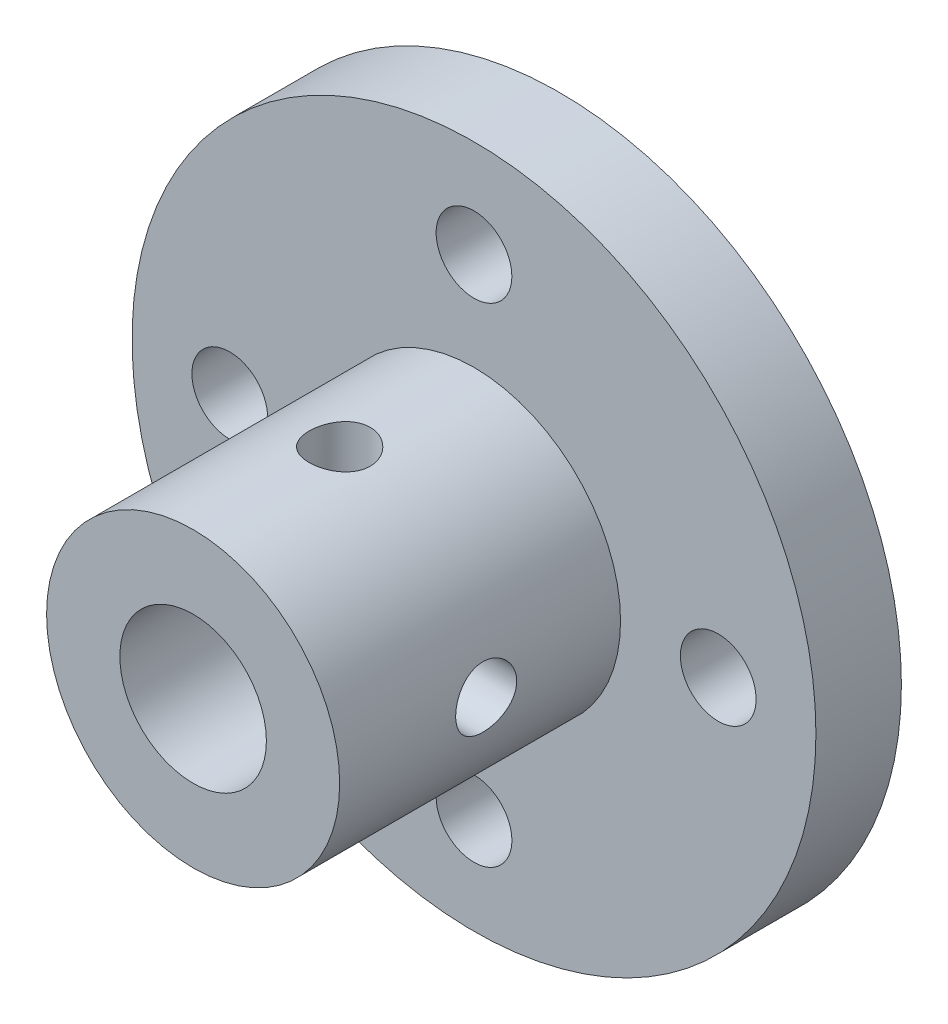
ISO-10303-21;
HEADER;
FILE_DESCRIPTION(('STEP AP214'),'2;1');
FILE_NAME('part.step','',(''),(''),'','','');
FILE_SCHEMA(('AUTOMOTIVE_DESIGN { 1 0 10303 214 1 1 1 1 }'));
ENDSEC;
DATA;
#1=APPLICATION_CONTEXT('core data for automotive mechanical design processes');
#2=APPLICATION_PROTOCOL_DEFINITION('international standard','automotive_design',2000,#1);
#3=PRODUCT_CONTEXT('',#1,'mechanical');
#4=PRODUCT('Part','Part','',(#3));
#5=PRODUCT_RELATED_PRODUCT_CATEGORY('part','',(#4));
#6=PRODUCT_DEFINITION_FORMATION('','',#4);
#7=PRODUCT_DEFINITION_CONTEXT('part definition',#1,'design');
#8=PRODUCT_DEFINITION('design','',#6,#7);
#9=PRODUCT_DEFINITION_SHAPE('','',#8);
#10=(LENGTH_UNIT() NAMED_UNIT(*) SI_UNIT(.MILLI.,.METRE.));
#11=(NAMED_UNIT(*) PLANE_ANGLE_UNIT() SI_UNIT($,.RADIAN.));
#12=(NAMED_UNIT(*) SI_UNIT($,.STERADIAN.) SOLID_ANGLE_UNIT());
#13=UNCERTAINTY_MEASURE_WITH_UNIT(LENGTH_MEASURE(1.E-05),#10,'distance_accuracy_value','');
#14=(GEOMETRIC_REPRESENTATION_CONTEXT(3) GLOBAL_UNCERTAINTY_ASSIGNED_CONTEXT((#13)) GLOBAL_UNIT_ASSIGNED_CONTEXT((#10,
#11,#12)) REPRESENTATION_CONTEXT('',''));
#15=CARTESIAN_POINT('',(0.,0.,0.));
#16=DIRECTION('',(0.,0.,1.));
#17=DIRECTION('',(1.,0.,0.));
#18=AXIS2_PLACEMENT_3D('',#15,#16,#17);
#19=CARTESIAN_POINT('',(0.,0.,3.5));
#20=DIRECTION('',(0.,0.,-1.));
#21=DIRECTION('',(-1.,0.,0.));
#22=AXIS2_PLACEMENT_3D('',#19,#20,#21);
#23=CYLINDRICAL_SURFACE('',#22,14.);
#24=CARTESIAN_POINT('',(0.,0.,3.5));
#25=DIRECTION('',(0.,0.,1.));
#26=DIRECTION('',(1.,0.,0.));
#27=AXIS2_PLACEMENT_3D('',#24,#25,#26);
#28=CIRCLE('',#27,14.);
#29=CARTESIAN_POINT('',(14.,0.,3.5));
#30=VERTEX_POINT('',#29);
#31=EDGE_CURVE('E63',#30,#30,#28,.T.);
#32=ORIENTED_EDGE('',*,*,#31,.F.);
#33=EDGE_LOOP('',(#32));
#34=FACE_BOUND('',#33,.T.);
#35=CARTESIAN_POINT('',(0.,0.,0.));
#36=DIRECTION('',(0.,0.,1.));
#37=DIRECTION('',(1.,0.,0.));
#38=AXIS2_PLACEMENT_3D('',#35,#36,#37);
#39=CIRCLE('',#38,14.);
#40=CARTESIAN_POINT('',(14.,0.,0.));
#41=VERTEX_POINT('',#40);
#42=EDGE_CURVE('E71',#41,#41,#39,.T.);
#43=ORIENTED_EDGE('',*,*,#42,.T.);
#44=EDGE_LOOP('',(#43));
#45=FACE_BOUND('',#44,.T.);
#46=ADVANCED_FACE('F50',(#34,#45),#23,.T.);
#47=CARTESIAN_POINT('',(0.,0.,3.5));
#48=DIRECTION('',(0.,0.,1.));
#49=DIRECTION('',(1.,0.,0.));
#50=AXIS2_PLACEMENT_3D('',#47,#48,#49);
#51=PLANE('',#50);
#52=CARTESIAN_POINT('',(-10.,0.,3.5));
#53=DIRECTION('',(0.,0.,1.));
#54=DIRECTION('',(0.,1.,0.));
#55=AXIS2_PLACEMENT_3D('',#52,#53,#54);
#56=CIRCLE('',#55,1.55);
#57=CARTESIAN_POINT('',(-10.,1.54999999999997,3.5));
#58=VERTEX_POINT('',#57);
#59=EDGE_CURVE('E192',#58,#58,#56,.T.);
#60=ORIENTED_EDGE('',*,*,#59,.F.);
#61=EDGE_LOOP('',(#60));
#62=FACE_BOUND('',#61,.T.);
#63=CARTESIAN_POINT('',(0.,-10.,3.5));
#64=DIRECTION('',(0.,0.,1.));
#65=DIRECTION('',(-1.,0.,0.));
#66=AXIS2_PLACEMENT_3D('',#63,#64,#65);
#67=CIRCLE('',#66,1.55);
#68=CARTESIAN_POINT('',(-1.55,-10.,3.5));
#69=VERTEX_POINT('',#68);
#70=EDGE_CURVE('E187',#69,#69,#67,.T.);
#71=ORIENTED_EDGE('',*,*,#70,.F.);
#72=EDGE_LOOP('',(#71));
#73=FACE_BOUND('',#72,.T.);
#74=CARTESIAN_POINT('',(10.,1.04744440165294E-13,3.5));
#75=DIRECTION('',(0.,0.,1.));
#76=DIRECTION('',(0.,-1.,0.));
#77=AXIS2_PLACEMENT_3D('',#74,#75,#76);
#78=CIRCLE('',#77,1.55);
#79=CARTESIAN_POINT('',(10.,-1.5499999999999,3.5));
#80=VERTEX_POINT('',#79);
#81=EDGE_CURVE('E111',#80,#80,#78,.T.);
#82=ORIENTED_EDGE('',*,*,#81,.F.);
#83=EDGE_LOOP('',(#82));
#84=FACE_BOUND('',#83,.T.);
#85=CARTESIAN_POINT('',(0.,10.,3.5));
#86=DIRECTION('',(0.,0.,1.));
#87=DIRECTION('',(1.,0.,0.));
#88=AXIS2_PLACEMENT_3D('',#85,#86,#87);
#89=CIRCLE('',#88,1.55);
#90=CARTESIAN_POINT('',(1.55,10.,3.5));
#91=VERTEX_POINT('',#90);
#92=EDGE_CURVE('E178',#91,#91,#89,.T.);
#93=ORIENTED_EDGE('',*,*,#92,.F.);
#94=EDGE_LOOP('',(#93));
#95=FACE_BOUND('',#94,.T.);
#96=CARTESIAN_POINT('',(0.,0.,3.5));
#97=DIRECTION('',(0.,0.,1.));
#98=DIRECTION('',(1.,0.,0.));
#99=AXIS2_PLACEMENT_3D('',#96,#97,#98);
#100=CIRCLE('',#99,6.);
#101=CARTESIAN_POINT('',(6.,0.,3.5));
#102=VERTEX_POINT('',#101);
#103=EDGE_CURVE('E10',#102,#102,#100,.T.);
#104=ORIENTED_EDGE('',*,*,#103,.F.);
#105=EDGE_LOOP('',(#104));
#106=FACE_BOUND('',#105,.T.);
#107=ORIENTED_EDGE('',*,*,#31,.T.);
#108=EDGE_LOOP('',(#107));
#109=FACE_BOUND('',#108,.T.);
#110=ADVANCED_FACE('F136',(#62,#73,#84,#95,#106,#109),#51,.T.);
#111=CARTESIAN_POINT('',(0.,0.,0.));
#112=DIRECTION('',(0.,0.,1.));
#113=DIRECTION('',(1.,0.,0.));
#114=AXIS2_PLACEMENT_3D('',#111,#112,#113);
#115=PLANE('',#114);
#116=CARTESIAN_POINT('',(-10.,0.,0.));
#117=DIRECTION('',(0.,0.,1.));
#118=DIRECTION('',(0.,1.,0.));
#119=AXIS2_PLACEMENT_3D('',#116,#117,#118);
#120=CIRCLE('',#119,1.55);
#121=CARTESIAN_POINT('',(-10.,1.54999999999997,0.));
#122=VERTEX_POINT('',#121);
#123=EDGE_CURVE('E115',#122,#122,#120,.T.);
#124=ORIENTED_EDGE('',*,*,#123,.T.);
#125=EDGE_LOOP('',(#124));
#126=FACE_BOUND('',#125,.T.);
#127=CARTESIAN_POINT('',(0.,-10.,0.));
#128=DIRECTION('',(0.,0.,1.));
#129=DIRECTION('',(-1.,0.,0.));
#130=AXIS2_PLACEMENT_3D('',#127,#128,#129);
#131=CIRCLE('',#130,1.55);
#132=CARTESIAN_POINT('',(-1.55,-10.,0.));
#133=VERTEX_POINT('',#132);
#134=EDGE_CURVE('E156',#133,#133,#131,.T.);
#135=ORIENTED_EDGE('',*,*,#134,.T.);
#136=EDGE_LOOP('',(#135));
#137=FACE_BOUND('',#136,.T.);
#138=CARTESIAN_POINT('',(10.,1.04744440165294E-13,0.));
#139=DIRECTION('',(0.,0.,1.));
#140=DIRECTION('',(0.,-1.,0.));
#141=AXIS2_PLACEMENT_3D('',#138,#139,#140);
#142=CIRCLE('',#141,1.55);
#143=CARTESIAN_POINT('',(10.,-1.5499999999999,0.));
#144=VERTEX_POINT('',#143);
#145=EDGE_CURVE('E160',#144,#144,#142,.T.);
#146=ORIENTED_EDGE('',*,*,#145,.T.);
#147=EDGE_LOOP('',(#146));
#148=FACE_BOUND('',#147,.T.);
#149=CARTESIAN_POINT('',(0.,10.,0.));
#150=DIRECTION('',(0.,0.,1.));
#151=DIRECTION('',(1.,0.,0.));
#152=AXIS2_PLACEMENT_3D('',#149,#150,#151);
#153=CIRCLE('',#152,1.55);
#154=CARTESIAN_POINT('',(1.55,10.,0.));
#155=VERTEX_POINT('',#154);
#156=EDGE_CURVE('E164',#155,#155,#153,.T.);
#157=ORIENTED_EDGE('',*,*,#156,.T.);
#158=EDGE_LOOP('',(#157));
#159=FACE_BOUND('',#158,.T.);
#160=CARTESIAN_POINT('',(0.,0.,0.));
#161=DIRECTION('',(0.,0.,1.));
#162=DIRECTION('',(1.,0.,0.));
#163=AXIS2_PLACEMENT_3D('',#160,#161,#162);
#164=CIRCLE('',#163,3.);
#165=CARTESIAN_POINT('',(3.,0.,0.));
#166=VERTEX_POINT('',#165);
#167=EDGE_CURVE('E167',#166,#166,#164,.T.);
#168=ORIENTED_EDGE('',*,*,#167,.T.);
#169=EDGE_LOOP('',(#168));
#170=FACE_BOUND('',#169,.T.);
#171=ORIENTED_EDGE('',*,*,#42,.F.);
#172=EDGE_LOOP('',(#171));
#173=FACE_BOUND('',#172,.T.);
#174=ADVANCED_FACE('F131',(#126,#137,#148,#159,#170,#173),#115,.F.);
#175=CARTESIAN_POINT('',(0.,0.,15.));
#176=DIRECTION('',(0.,0.,-1.));
#177=DIRECTION('',(-1.,0.,0.));
#178=AXIS2_PLACEMENT_3D('',#175,#176,#177);
#179=CYLINDRICAL_SURFACE('',#178,6.);
#180=CARTESIAN_POINT('',(0.,6.,7.75));
#181=CARTESIAN_POINT('',(0.0694090417016604,5.99999871526651,7.75000247746923));
#182=CARTESIAN_POINT('',(0.138848789520875,5.99878328775043,7.75580066571875));
#183=CARTESIAN_POINT('',(0.275761316266992,5.9940520099068,7.77881934953285));
#184=CARTESIAN_POINT('',(0.343232560128311,5.99053441189248,7.79604852303693));
#185=CARTESIAN_POINT('',(0.47420913229134,5.98159109196202,7.84137045492182));
#186=CARTESIAN_POINT('',(0.537718336709182,5.97616727052645,7.86945239599889));
#187=CARTESIAN_POINT('',(0.659120328605955,5.96399927809859,7.93564960885619));
#188=CARTESIAN_POINT('',(0.717013367534323,5.95725516625975,7.97376443115583));
#189=CARTESIAN_POINT('',(0.826390324308833,5.9430770002465,8.05953634019065));
#190=CARTESIAN_POINT('',(0.87778024416268,5.93563505848532,8.10731200123508));
#191=CARTESIAN_POINT('',(0.971877776769388,5.92095657692448,8.21079465919511));
#192=CARTESIAN_POINT('',(1.01458467096098,5.91372005416683,8.26650231187226));
#193=CARTESIAN_POINT('',(1.09051031677216,5.90019442595308,8.38495196876616));
#194=CARTESIAN_POINT('',(1.1236305468065,5.89391545174828,8.44775838450274));
#195=CARTESIAN_POINT('',(1.17881119348063,5.8831284065002,8.57819745177276));
#196=CARTESIAN_POINT('',(1.20087280167641,5.87862014467568,8.64582958244254));
#197=CARTESIAN_POINT('',(1.23300240133736,5.87196500986123,8.78298523741564));
#198=CARTESIAN_POINT('',(1.24323597696798,5.86978556855865,8.85246835933477));
#199=CARTESIAN_POINT('',(1.25193357655614,5.86793690716491,8.99219684286263));
#200=CARTESIAN_POINT('',(1.25039890894686,5.86826740800981,9.06244211886529));
#201=CARTESIAN_POINT('',(1.23573719037197,5.87137174319175,9.20048102797517));
#202=CARTESIAN_POINT('',(1.2228010523272,5.87410533679901,9.26829597966121));
#203=CARTESIAN_POINT('',(1.18600543529945,5.88164437615942,9.40077150964492));
#204=CARTESIAN_POINT('',(1.16214539481381,5.88644992841317,9.46543192560633));
#205=CARTESIAN_POINT('',(1.10400003213928,5.89763191464102,9.59030722841598));
#206=CARTESIAN_POINT('',(1.06964002534236,5.90401953785586,9.65048629652707));
#207=CARTESIAN_POINT('',(0.991522699274814,5.91763890010721,9.76429574426815));
#208=CARTESIAN_POINT('',(0.947764212262584,5.92487074398537,9.81792530883597));
#209=CARTESIAN_POINT('',(0.851074921546779,5.93953730929909,9.91821396108036));
#210=CARTESIAN_POINT('',(0.797981433412079,5.94697323199473,9.96471616889701));
#211=CARTESIAN_POINT('',(0.684667288611794,5.96108088143001,10.048180442229));
#212=CARTESIAN_POINT('',(0.624446525025761,5.96775259670236,10.0851423645984));
#213=CARTESIAN_POINT('',(0.498405541235474,5.97959870942815,10.1485100815359));
#214=CARTESIAN_POINT('',(0.432575461926496,5.98477039710258,10.1748968045671));
#215=CARTESIAN_POINT('',(0.297284620972152,5.99301338211281,10.2161917048355));
#216=CARTESIAN_POINT('',(0.227824338595087,5.99608495596053,10.2311013932314));
#217=CARTESIAN_POINT('',(0.088591865700834,5.99974275215456,10.2487942520679));
#218=CARTESIAN_POINT('',(0.018848055526178,6.00037293537579,10.2517919414942));
#219=CARTESIAN_POINT('',(-0.120143798757714,5.99919952252774,10.2461550500309));
#220=CARTESIAN_POINT('',(-0.189391872962257,5.99739607548153,10.2375211813984));
#221=CARTESIAN_POINT('',(-0.324726367119812,5.99158564979184,10.2090443465305));
#222=CARTESIAN_POINT('',(-0.390837192894205,5.98760052868077,10.1893125146165));
#223=CARTESIAN_POINT('',(-0.51881144666133,5.97787227242395,10.1393221395786));
#224=CARTESIAN_POINT('',(-0.580674536336773,5.97212899744579,10.109062759134));
#225=CARTESIAN_POINT('',(-0.699294306943491,5.95941241490714,10.0384196217624));
#226=CARTESIAN_POINT('',(-0.755973219469832,5.9524239381233,9.99790807043093));
#227=CARTESIAN_POINT('',(-0.861805445886517,5.93802568299709,9.90808043692372));
#228=CARTESIAN_POINT('',(-0.910957877913283,5.93061585542511,9.85876332448105));
#229=CARTESIAN_POINT('',(-1.0011786486518,5.91606024531377,9.75174442300029));
#230=CARTESIAN_POINT('',(-1.04209914600204,5.90892089307501,9.69391696804471));
#231=CARTESIAN_POINT('',(-1.11364719079243,5.89585601015806,9.57208371578621));
#232=CARTESIAN_POINT('',(-1.14427516677864,5.88993042894651,9.50807817586089));
#233=CARTESIAN_POINT('',(-1.19417246443922,5.88001700708041,9.37603880370176));
#234=CARTESIAN_POINT('',(-1.21350309828031,5.87601872784687,9.30802896283416));
#235=CARTESIAN_POINT('',(-1.24044038523407,5.87039184709697,9.16963344950774));
#236=CARTESIAN_POINT('',(-1.2480487154444,5.86876290660367,9.09924811838056));
#237=CARTESIAN_POINT('',(-1.25125926487611,5.86807907308506,8.95958659900035));
#238=CARTESIAN_POINT('',(-1.24709542622725,5.86897402321502,8.89031592977794));
#239=CARTESIAN_POINT('',(-1.22739905314031,5.87312447254928,8.75348599107978));
#240=CARTESIAN_POINT('',(-1.21186662782266,5.87637994909626,8.68592670518389));
#241=CARTESIAN_POINT('',(-1.16998217768584,5.88486132447716,8.55460222810934));
#242=CARTESIAN_POINT('',(-1.14366117568421,5.8900815700793,8.49082675351307));
#243=CARTESIAN_POINT('',(-1.08097457299757,5.90190705738738,8.36856122397334));
#244=CARTESIAN_POINT('',(-1.04460803983029,5.9085124276546,8.31007166036688));
#245=CARTESIAN_POINT('',(-0.962073695342405,5.92251579551146,8.19887837292056));
#246=CARTESIAN_POINT('',(-0.91573789041822,5.92992613868404,8.14630087543502));
#247=CARTESIAN_POINT('',(-0.814924438115329,5.94461839583213,8.04959050677364));
#248=CARTESIAN_POINT('',(-0.760444918832963,5.9519002798488,8.00545958244852));
#249=CARTESIAN_POINT('',(-0.644134427507698,5.96561444547638,7.92641142681594));
#250=CARTESIAN_POINT('',(-0.582225921521344,5.97203596073244,7.89160632011372));
#251=CARTESIAN_POINT('',(-0.453319843998451,5.98319908494092,7.83294977156998));
#252=CARTESIAN_POINT('',(-0.386326781907241,5.98794216182101,7.80908875281813));
#253=CARTESIAN_POINT('',(-0.266015292900104,5.99432499781444,7.77745972171158));
#254=CARTESIAN_POINT('',(-0.213367593727928,5.99644035661395,7.76718123679115));
#255=CARTESIAN_POINT('',(-0.107152674176536,5.99927832789758,7.75345054572267));
#256=CARTESIAN_POINT('',(-0.0535854878488716,6.00000099184586,7.74999808733281));
#257=CARTESIAN_POINT('',(0.,6.,7.75));
#258=B_SPLINE_CURVE_WITH_KNOTS('',3,(#180,#181,#182,#183,#184,#185,#186,#187,#188,#189,#190,
#191,#192,#193,#194,#195,#196,#197,#198,#199,#200,#201,#202,#203,#204,#205,#206,#207,#208,#209,
#210,#211,#212,#213,#214,#215,#216,#217,#218,#219,#220,#221,#222,#223,#224,#225,#226,#227,#228,
#229,#230,#231,#232,#233,#234,#235,#236,#237,#238,#239,#240,#241,#242,#243,#244,#245,#246,#247,
#248,#249,#250,#251,#252,#253,#254,#255,#256,#257),.UNSPECIFIED.,.T.,.F.,(4,2,2,2,2,2,2,2,2,2,2,
2,2,2,2,2,2,2,2,2,2,2,2,2,2,2,2,2,2,2,2,2,2,2,2,2,2,2,4),(0.,0.208031045103182,
0.416220199906223,0.62420237882544,0.832175241572986,1.04287526388122,1.25359271551785,
1.46640449178548,1.6791933328549,1.88896575169853,2.09871484767163,2.30501712129059,
2.51133000030278,2.71914592416747,2.92698768368033,3.13889526355464,3.35080602278216,
3.56309724499661,3.7753605104577,3.98378339407674,4.19219351552275,4.39855286632619,
4.60492863390931,4.81401583995734,5.02312752564572,5.23571263829334,5.44828889851306,
5.65970050095022,5.87108185414182,6.07829223291035,6.28550062281358,6.49211731393252,
6.69875319081477,6.90919024830306,7.11967575117366,7.33258864398253,7.5453148646497,
7.70592588477276,7.86653096973387),.UNSPECIFIED.);
#259=CARTESIAN_POINT('',(0.,6.,7.75));
#260=VERTEX_POINT('',#259);
#261=EDGE_CURVE('E53',#260,#260,#258,.T.);
#262=ORIENTED_EDGE('',*,*,#261,.T.);
#263=EDGE_LOOP('',(#262));
#264=FACE_BOUND('',#263,.T.);
#265=CARTESIAN_POINT('',(6.,0.,10.25));
#266=CARTESIAN_POINT('',(5.99999871526651,0.0694090417016603,10.2499975225308));
#267=CARTESIAN_POINT('',(5.99878328775043,0.138848789520875,10.2441993342812));
#268=CARTESIAN_POINT('',(5.9940520099068,0.275761316266992,10.2211806504671));
#269=CARTESIAN_POINT('',(5.99053441189248,0.343232560128311,10.2039514769631));
#270=CARTESIAN_POINT('',(5.98159109196202,0.47420913229134,10.1586295450782));
#271=CARTESIAN_POINT('',(5.97616727052645,0.537718336709182,10.1305476040011));
#272=CARTESIAN_POINT('',(5.96399927809859,0.659120328605955,10.0643503911438));
#273=CARTESIAN_POINT('',(5.95725516625975,0.717013367534323,10.0262355688442));
#274=CARTESIAN_POINT('',(5.9430770002465,0.826390324308832,9.94046365980935));
#275=CARTESIAN_POINT('',(5.93563505848532,0.87778024416268,9.89268799876491));
#276=CARTESIAN_POINT('',(5.92095657692448,0.971877776769387,9.78920534080489));
#277=CARTESIAN_POINT('',(5.91372005416683,1.01458467096098,9.73349768812773));
#278=CARTESIAN_POINT('',(5.90019442595308,1.09051031677216,9.61504803123384));
#279=CARTESIAN_POINT('',(5.89391545174828,1.1236305468065,9.55224161549725));
#280=CARTESIAN_POINT('',(5.8831284065002,1.17881119348063,9.42180254822724));
#281=CARTESIAN_POINT('',(5.87862014467568,1.20087280167641,9.35417041755746));
#282=CARTESIAN_POINT('',(5.87196500986123,1.23300240133736,9.21701476258436));
#283=CARTESIAN_POINT('',(5.86978556855865,1.24323597696798,9.14753164066523));
#284=CARTESIAN_POINT('',(5.86793690716491,1.25193357655614,9.00780315713737));
#285=CARTESIAN_POINT('',(5.86826740800981,1.25039890894686,8.9375578811347));
#286=CARTESIAN_POINT('',(5.87137174319175,1.23573719037197,8.79951897202482));
#287=CARTESIAN_POINT('',(5.87410533679901,1.2228010523272,8.73170402033879));
#288=CARTESIAN_POINT('',(5.88164437615942,1.18600543529945,8.59922849035507));
#289=CARTESIAN_POINT('',(5.88644992841317,1.16214539481381,8.53456807439367));
#290=CARTESIAN_POINT('',(5.89763191464102,1.10400003213928,8.40969277158402));
#291=CARTESIAN_POINT('',(5.90401953785586,1.06964002534236,8.34951370347293));
#292=CARTESIAN_POINT('',(5.91763890010721,0.991522699274813,8.23570425573184));
#293=CARTESIAN_POINT('',(5.92487074398537,0.947764212262583,8.18207469116403));
#294=CARTESIAN_POINT('',(5.93953730929909,0.851074921546779,8.08178603891963));
#295=CARTESIAN_POINT('',(5.94697323199473,0.797981433412079,8.03528383110299));
#296=CARTESIAN_POINT('',(5.96108088143001,0.684667288611794,7.95181955777103));
#297=CARTESIAN_POINT('',(5.96775259670236,0.624446525025761,7.91485763540161));
#298=CARTESIAN_POINT('',(5.97959870942815,0.498405541235474,7.85148991846405));
#299=CARTESIAN_POINT('',(5.98477039710258,0.432575461926496,7.82510319543288));
#300=CARTESIAN_POINT('',(5.99301338211281,0.297284620972152,7.78380829516451));
#301=CARTESIAN_POINT('',(5.99608495596053,0.227824338595087,7.7688986067686));
#302=CARTESIAN_POINT('',(5.99974275215456,0.088591865700834,7.75120574793212));
#303=CARTESIAN_POINT('',(6.00037293537579,0.018848055526178,7.74820805850575));
#304=CARTESIAN_POINT('',(5.99919952252774,-0.120143798757714,7.75384494996911));
#305=CARTESIAN_POINT('',(5.99739607548153,-0.189391872962257,7.7624788186016));
#306=CARTESIAN_POINT('',(5.99158564979184,-0.324726367119812,7.79095565346954));
#307=CARTESIAN_POINT('',(5.98760052868077,-0.390837192894205,7.81068748538347));
#308=CARTESIAN_POINT('',(5.97787227242395,-0.51881144666133,7.86067786042141));
#309=CARTESIAN_POINT('',(5.97212899744579,-0.580674536336773,7.89093724086598));
#310=CARTESIAN_POINT('',(5.95941241490714,-0.699294306943491,7.96158037823756));
#311=CARTESIAN_POINT('',(5.9524239381233,-0.755973219469831,8.00209192956907));
#312=CARTESIAN_POINT('',(5.93802568299709,-0.861805445886517,8.09191956307627));
#313=CARTESIAN_POINT('',(5.93061585542511,-0.910957877913282,8.14123667551894));
#314=CARTESIAN_POINT('',(5.91606024531377,-1.0011786486518,8.2482555769997));
#315=CARTESIAN_POINT('',(5.90892089307501,-1.04209914600204,8.30608303195528));
#316=CARTESIAN_POINT('',(5.89585601015806,-1.11364719079243,8.42791628421379));
#317=CARTESIAN_POINT('',(5.88993042894651,-1.14427516677864,8.49192182413911));
#318=CARTESIAN_POINT('',(5.88001700708041,-1.19417246443922,8.62396119629823));
#319=CARTESIAN_POINT('',(5.87601872784687,-1.21350309828031,8.69197103716584));
#320=CARTESIAN_POINT('',(5.87039184709697,-1.24044038523407,8.83036655049226));
#321=CARTESIAN_POINT('',(5.86876290660367,-1.2480487154444,8.90075188161944));
#322=CARTESIAN_POINT('',(5.86807907308506,-1.25125926487611,9.04041340099965));
#323=CARTESIAN_POINT('',(5.86897402321502,-1.24709542622725,9.10968407022205));
#324=CARTESIAN_POINT('',(5.87312447254928,-1.22739905314031,9.24651400892022));
#325=CARTESIAN_POINT('',(5.87637994909626,-1.21186662782266,9.3140732948161));
#326=CARTESIAN_POINT('',(5.88486132447716,-1.16998217768584,9.44539777189065));
#327=CARTESIAN_POINT('',(5.8900815700793,-1.14366117568421,9.50917324648692));
#328=CARTESIAN_POINT('',(5.90190705738738,-1.08097457299757,9.63143877602666));
#329=CARTESIAN_POINT('',(5.9085124276546,-1.04460803983029,9.68992833963312));
#330=CARTESIAN_POINT('',(5.92251579551146,-0.962073695342405,9.80112162707944));
#331=CARTESIAN_POINT('',(5.92992613868404,-0.91573789041822,9.85369912456498));
#332=CARTESIAN_POINT('',(5.94461839583213,-0.814924438115329,9.95040949322635));
#333=CARTESIAN_POINT('',(5.9519002798488,-0.760444918832963,9.99454041755148));
#334=CARTESIAN_POINT('',(5.96561444547638,-0.644134427507698,10.0735885731841));
#335=CARTESIAN_POINT('',(5.97203596073244,-0.582225921521344,10.1083936798863));
#336=CARTESIAN_POINT('',(5.98319908494092,-0.45331984399845,10.16705022843));
#337=CARTESIAN_POINT('',(5.98794216182101,-0.386326781907241,10.1909112471819));
#338=CARTESIAN_POINT('',(5.99432499781444,-0.266015292900103,10.2225402782884));
#339=CARTESIAN_POINT('',(5.99644035661395,-0.213367593727927,10.2328187632088));
#340=CARTESIAN_POINT('',(5.99927832789758,-0.107152674176536,10.2465494542773));
#341=CARTESIAN_POINT('',(6.00000099184586,-0.0535854878488713,10.2500019126672));
#342=CARTESIAN_POINT('',(6.,0.,10.25));
#343=B_SPLINE_CURVE_WITH_KNOTS('',3,(#265,#266,#267,#268,#269,#270,#271,#272,#273,#274,#275,
#276,#277,#278,#279,#280,#281,#282,#283,#284,#285,#286,#287,#288,#289,#290,#291,#292,#293,#294,
#295,#296,#297,#298,#299,#300,#301,#302,#303,#304,#305,#306,#307,#308,#309,#310,#311,#312,#313,
#314,#315,#316,#317,#318,#319,#320,#321,#322,#323,#324,#325,#326,#327,#328,#329,#330,#331,#332,
#333,#334,#335,#336,#337,#338,#339,#340,#341,#342),.UNSPECIFIED.,.T.,.F.,(4,2,2,2,2,2,2,2,2,2,2,
2,2,2,2,2,2,2,2,2,2,2,2,2,2,2,2,2,2,2,2,2,2,2,2,2,2,2,4),(0.,0.208031045103182,
0.416220199906223,0.62420237882544,0.832175241572986,1.04287526388122,1.25359271551785,
1.46640449178548,1.67919333285489,1.88896575169853,2.09871484767163,2.30501712129058,
2.51133000030278,2.71914592416748,2.92698768368033,3.13889526355464,3.35080602278216,
3.56309724499661,3.7753605104577,3.98378339407674,4.19219351552275,4.39855286632619,
4.60492863390931,4.81401583995734,5.02312752564572,5.23571263829334,5.44828889851306,
5.65970050095022,5.87108185414182,6.07829223291036,6.28550062281358,6.49211731393252,
6.69875319081477,6.90919024830306,7.11967575117366,7.33258864398253,7.5453148646497,
7.70592588477276,7.86653096973387),.UNSPECIFIED.);
#344=CARTESIAN_POINT('',(6.,0.,10.25));
#345=VERTEX_POINT('',#344);
#346=EDGE_CURVE('E79',#345,#345,#343,.T.);
#347=ORIENTED_EDGE('',*,*,#346,.T.);
#348=EDGE_LOOP('',(#347));
#349=FACE_BOUND('',#348,.T.);
#350=CARTESIAN_POINT('',(0.,0.,15.));
#351=DIRECTION('',(0.,0.,1.));
#352=DIRECTION('',(1.,0.,0.));
#353=AXIS2_PLACEMENT_3D('',#350,#351,#352);
#354=CIRCLE('',#353,6.);
#355=CARTESIAN_POINT('',(6.,0.,15.));
#356=VERTEX_POINT('',#355);
#357=EDGE_CURVE('E74',#356,#356,#354,.T.);
#358=ORIENTED_EDGE('',*,*,#357,.F.);
#359=EDGE_LOOP('',(#358));
#360=FACE_BOUND('',#359,.T.);
#361=ORIENTED_EDGE('',*,*,#103,.T.);
#362=EDGE_LOOP('',(#361));
#363=FACE_BOUND('',#362,.T.);
#364=ADVANCED_FACE('F88',(#264,#349,#360,#363),#179,.T.);
#365=CARTESIAN_POINT('',(0.,0.,15.));
#366=DIRECTION('',(0.,0.,1.));
#367=DIRECTION('',(1.,0.,0.));
#368=AXIS2_PLACEMENT_3D('',#365,#366,#367);
#369=PLANE('',#368);
#370=CARTESIAN_POINT('',(0.,0.,15.));
#371=DIRECTION('',(0.,0.,1.));
#372=DIRECTION('',(1.,0.,0.));
#373=AXIS2_PLACEMENT_3D('',#370,#371,#372);
#374=CIRCLE('',#373,3.);
#375=CARTESIAN_POINT('',(3.,0.,15.));
#376=VERTEX_POINT('',#375);
#377=EDGE_CURVE('E170',#376,#376,#374,.T.);
#378=ORIENTED_EDGE('',*,*,#377,.F.);
#379=EDGE_LOOP('',(#378));
#380=FACE_BOUND('',#379,.T.);
#381=ORIENTED_EDGE('',*,*,#357,.T.);
#382=EDGE_LOOP('',(#381));
#383=FACE_BOUND('',#382,.T.);
#384=ADVANCED_FACE('F122',(#380,#383),#369,.T.);
#385=CARTESIAN_POINT('',(0.,0.,0.));
#386=DIRECTION('',(0.,0.,1.));
#387=DIRECTION('',(1.,0.,0.));
#388=AXIS2_PLACEMENT_3D('',#385,#386,#387);
#389=CYLINDRICAL_SURFACE('',#388,3.);
#390=CARTESIAN_POINT('',(0.,3.,7.75));
#391=CARTESIAN_POINT('',(-0.0669580526362665,2.99999458367273,7.7500072050913));
#392=CARTESIAN_POINT('',(-0.13402139706384,2.9977323297471,7.75541195852814));
#393=CARTESIAN_POINT('',(-0.266247371156346,2.98890153579552,7.77683906492018));
#394=CARTESIAN_POINT('',(-0.331404576423563,2.98232175901028,7.79288912446425));
#395=CARTESIAN_POINT('',(-0.457688733653086,2.96556289038127,7.83491109178059));
#396=CARTESIAN_POINT('',(-0.518828524426267,2.95539599975004,7.86084938946815));
#397=CARTESIAN_POINT('',(-0.6358297566798,2.93245286470664,7.92177282323257));
#398=CARTESIAN_POINT('',(-0.691692790015937,2.91967741092849,7.95675521897087));
#399=CARTESIAN_POINT('',(-0.799448403559508,2.89207828351869,8.03662898259088));
#400=CARTESIAN_POINT('',(-0.851041267517765,2.87718753326093,8.08190130878975));
#401=CARTESIAN_POINT('',(-0.946159821091258,2.84732714068514,8.18026433478257));
#402=CARTESIAN_POINT('',(-0.989681263153081,2.8323574610681,8.23335912489451));
#403=CARTESIAN_POINT('',(-1.06953737697065,2.80321021812995,8.34902677756489));
#404=CARTESIAN_POINT('',(-1.10541308153925,2.78910786873385,8.41193744842655));
#405=CARTESIAN_POINT('',(-1.16593940588865,2.76435572357005,8.54357325792093));
#406=CARTESIAN_POINT('',(-1.1905958083629,2.75370415000824,8.61229537948445));
#407=CARTESIAN_POINT('',(-1.22674598312158,2.73778555387705,8.75015369176792));
#408=CARTESIAN_POINT('',(-1.23881657877605,2.73228387651787,8.81911048339215));
#409=CARTESIAN_POINT('',(-1.25125209967796,2.72661326219504,8.95827329268657));
#410=CARTESIAN_POINT('',(-1.25162348054397,2.7264413842526,9.02847860002574));
#411=CARTESIAN_POINT('',(-1.24108450363673,2.73125119560853,9.16240006043494));
#412=CARTESIAN_POINT('',(-1.231036811123,2.73583882723623,9.22620109656446));
#413=CARTESIAN_POINT('',(-1.20139191015776,2.74898482773797,9.35111209100039));
#414=CARTESIAN_POINT('',(-1.18179287287176,2.75754395703564,9.41222153149177));
#415=CARTESIAN_POINT('',(-1.1332195872757,2.77786184772757,9.53155770299144));
#416=CARTESIAN_POINT('',(-1.10405471539235,2.78968481949136,9.58969542091338));
#417=CARTESIAN_POINT('',(-1.03731242580562,2.81518331141086,9.70047773388014));
#418=CARTESIAN_POINT('',(-0.999731690519538,2.8288595612978,9.75312015061351));
#419=CARTESIAN_POINT('',(-0.91349596554383,2.85792976877979,9.85609995873283));
#420=CARTESIAN_POINT('',(-0.864173483207521,2.87337121404473,9.90586656738543));
#421=CARTESIAN_POINT('',(-0.757729591051507,2.90325673112529,9.99661350295918));
#422=CARTESIAN_POINT('',(-0.700606359448452,2.9177005687701,10.0375917716922));
#423=CARTESIAN_POINT('',(-0.578447948693372,2.94438283556473,10.1104358236163));
#424=CARTESIAN_POINT('',(-0.513260582447676,2.95656266543334,10.1420694451507));
#425=CARTESIAN_POINT('',(-0.377852402526829,2.97689481414803,10.1937211396033));
#426=CARTESIAN_POINT('',(-0.307634394795032,2.985049358458,10.2137456319438));
#427=CARTESIAN_POINT('',(-0.168928113346226,2.99599641186385,10.2404159921266));
#428=CARTESIAN_POINT('',(-0.100611285278637,2.99909541047125,10.2478278574437));
#429=CARTESIAN_POINT('',(0.0363546554960902,3.00056050368745,10.2513462236141));
#430=CARTESIAN_POINT('',(0.105003667152636,2.99892795711939,10.247455970252));
#431=CARTESIAN_POINT('',(0.237098242341435,2.9913121765694,10.2290289151939));
#432=CARTESIAN_POINT('',(0.300632966639387,2.9855488728399,10.2150300459028));
#433=CARTESIAN_POINT('',(0.42438274897109,2.97048606772414,10.1775318054592));
#434=CARTESIAN_POINT('',(0.48459738651836,2.96118611959704,10.1540312340497));
#435=CARTESIAN_POINT('',(0.602108999869135,2.93958270645166,10.0974290242879));
#436=CARTESIAN_POINT('',(0.659257236855322,2.92719491469281,10.064051816854));
#437=CARTESIAN_POINT('',(0.767346216231427,2.9007380457909,9.9889466222083));
#438=CARTESIAN_POINT('',(0.818284352601939,2.88666826768733,9.94721514847072));
#439=CARTESIAN_POINT('',(0.916333430274262,2.85712087895438,9.85309676672759));
#440=CARTESIAN_POINT('',(0.962910697979833,2.84161451591029,9.80016149701373));
#441=CARTESIAN_POINT('',(1.04666984610551,2.81184336768005,9.6869787240646));
#442=CARTESIAN_POINT('',(1.08384959285617,2.79757886493439,9.62672956482826));
#443=CARTESIAN_POINT('',(1.14815960208699,2.77181386243988,9.49938582469742));
#444=CARTESIAN_POINT('',(1.17513918237328,2.76035562555112,9.43220596448517));
#445=CARTESIAN_POINT('',(1.21717413951572,2.74208355658957,9.29362940618989));
#446=CARTESIAN_POINT('',(1.23223934863687,2.73526589555752,9.22223623751665));
#447=CARTESIAN_POINT('',(1.249040803489,2.72763164537264,9.08318130080079));
#448=CARTESIAN_POINT('',(1.25171380413129,2.72639350967163,9.01565533770738));
#449=CARTESIAN_POINT('',(1.24615575523912,2.72893853011024,8.8811571388589));
#450=CARTESIAN_POINT('',(1.23792637964721,2.73272091540307,8.8141848196863));
#451=CARTESIAN_POINT('',(1.21158404780491,2.74449551302268,8.68590725253111));
#452=CARTESIAN_POINT('',(1.19394903571465,2.75228354846481,8.62448332653661));
#453=CARTESIAN_POINT('',(1.14976328202134,2.77103181199189,8.50545197864277));
#454=CARTESIAN_POINT('',(1.12321003517251,2.78199293131694,8.44784563460122));
#455=CARTESIAN_POINT('',(1.06010285935489,2.80666954560013,8.33430410405088));
#456=CARTESIAN_POINT('',(1.02304360910482,2.8205110271368,8.27867766983171));
#457=CARTESIAN_POINT('',(0.940684072630383,2.8490368905384,8.17413986063932));
#458=CARTESIAN_POINT('',(0.895380928905611,2.86372156345875,8.12523082439943));
#459=CARTESIAN_POINT('',(0.793902045778814,2.89356392850106,8.03185131831526));
#460=CARTESIAN_POINT('',(0.737174739949021,2.90867817511792,7.98796356715935));
#461=CARTESIAN_POINT('',(0.616600079253193,2.9366014362202,7.91030054645638));
#462=CARTESIAN_POINT('',(0.55274949794574,2.94940939916741,7.87652988511045));
#463=CARTESIAN_POINT('',(0.420732056717945,2.97109183362461,7.82079015456012));
#464=CARTESIAN_POINT('',(0.352653990980631,2.98002782581964,7.7986352333827));
#465=CARTESIAN_POINT('',(0.213410421846554,2.99321009768625,7.76629367092217));
#466=CARTESIAN_POINT('',(0.142255316980953,2.99747105811967,7.75606955747012));
#467=CARTESIAN_POINT('',(0.0472360819191806,2.99972287568934,7.75066683891356));
#468=CARTESIAN_POINT('',(0.0236245946756558,3.00000191102536,7.74999745785078));
#469=CARTESIAN_POINT('',(0.,3.,7.75));
#470=B_SPLINE_CURVE_WITH_KNOTS('',3,(#390,#391,#392,#393,#394,#395,#396,#397,#398,#399,#400,
#401,#402,#403,#404,#405,#406,#407,#408,#409,#410,#411,#412,#413,#414,#415,#416,#417,#418,#419,
#420,#421,#422,#423,#424,#425,#426,#427,#428,#429,#430,#431,#432,#433,#434,#435,#436,#437,#438,
#439,#440,#441,#442,#443,#444,#445,#446,#447,#448,#449,#450,#451,#452,#453,#454,#455,#456,#457,
#458,#459,#460,#461,#462,#463,#464,#465,#466,#467,#468,#469),.UNSPECIFIED.,.T.,.F.,(4,2,2,2,2,2,
2,2,2,2,2,2,2,2,2,2,2,2,2,2,2,2,2,2,2,2,2,2,2,2,2,2,2,2,2,2,2,2,2,4),(0.,0.200806918883938,
0.402138540628695,0.602791851906298,0.803384436852971,1.01317936288806,1.22308438131465,
1.44331724539125,1.66343646730587,1.87295273137557,2.08235338249045,2.27570157202556,
2.46908679727212,2.66658713058714,2.86416545717205,3.07844141127895,3.29276749314587,
3.51204055060812,3.73119224218296,3.93648443393249,4.1417176749317,4.3367658973572,
4.53183876601783,4.73297135272159,4.93418805469494,5.14978488029292,5.36543061240339,
5.58414788359521,5.80268447074578,6.00439877559641,6.20608211297534,6.3983764996476,
6.5907249495061,6.79463893397438,6.99862373425941,7.21746535004886,7.43640649428579,
7.65172855819382,7.86637250469318,7.93722256499094),.UNSPECIFIED.);
#471=CARTESIAN_POINT('',(0.,3.,7.75));
#472=VERTEX_POINT('',#471);
#473=EDGE_CURVE('E87',#472,#472,#470,.T.);
#474=ORIENTED_EDGE('',*,*,#473,.T.);
#475=EDGE_LOOP('',(#474));
#476=FACE_BOUND('',#475,.T.);
#477=CARTESIAN_POINT('',(3.,0.,7.75));
#478=CARTESIAN_POINT('',(2.99999458367273,0.0669580526362665,7.7500072050913));
#479=CARTESIAN_POINT('',(2.9977323297471,0.13402139706384,7.75541195852814));
#480=CARTESIAN_POINT('',(2.98890153579552,0.266247371156346,7.77683906492018));
#481=CARTESIAN_POINT('',(2.98232175901028,0.331404576423563,7.79288912446425));
#482=CARTESIAN_POINT('',(2.96556289038127,0.457688733653086,7.83491109178059));
#483=CARTESIAN_POINT('',(2.95539599975004,0.518828524426267,7.86084938946815));
#484=CARTESIAN_POINT('',(2.93245286470664,0.6358297566798,7.92177282323257));
#485=CARTESIAN_POINT('',(2.91967741092849,0.691692790015937,7.95675521897087));
#486=CARTESIAN_POINT('',(2.89207828351869,0.799448403559508,8.03662898259088));
#487=CARTESIAN_POINT('',(2.87718753326093,0.851041267517765,8.08190130878975));
#488=CARTESIAN_POINT('',(2.84732714068514,0.946159821091258,8.18026433478257));
#489=CARTESIAN_POINT('',(2.8323574610681,0.989681263153081,8.23335912489451));
#490=CARTESIAN_POINT('',(2.80321021812995,1.06953737697065,8.34902677756489));
#491=CARTESIAN_POINT('',(2.78910786873385,1.10541308153925,8.41193744842655));
#492=CARTESIAN_POINT('',(2.76435572357005,1.16593940588865,8.54357325792093));
#493=CARTESIAN_POINT('',(2.75370415000824,1.1905958083629,8.61229537948445));
#494=CARTESIAN_POINT('',(2.73778555387705,1.22674598312158,8.75015369176792));
#495=CARTESIAN_POINT('',(2.73228387651787,1.23881657877605,8.81911048339215));
#496=CARTESIAN_POINT('',(2.72661326219504,1.25125209967796,8.95827329268657));
#497=CARTESIAN_POINT('',(2.7264413842526,1.25162348054397,9.02847860002574));
#498=CARTESIAN_POINT('',(2.73125119560853,1.24108450363673,9.16240006043494));
#499=CARTESIAN_POINT('',(2.73583882723623,1.231036811123,9.22620109656446));
#500=CARTESIAN_POINT('',(2.74898482773797,1.20139191015776,9.35111209100039));
#501=CARTESIAN_POINT('',(2.75754395703564,1.18179287287176,9.41222153149177));
#502=CARTESIAN_POINT('',(2.77786184772757,1.1332195872757,9.53155770299144));
#503=CARTESIAN_POINT('',(2.78968481949136,1.10405471539235,9.58969542091338));
#504=CARTESIAN_POINT('',(2.81518331141086,1.03731242580562,9.70047773388014));
#505=CARTESIAN_POINT('',(2.8288595612978,0.999731690519538,9.75312015061351));
#506=CARTESIAN_POINT('',(2.85792976877979,0.91349596554383,9.85609995873283));
#507=CARTESIAN_POINT('',(2.87337121404473,0.864173483207521,9.90586656738543));
#508=CARTESIAN_POINT('',(2.90325673112529,0.757729591051507,9.99661350295918));
#509=CARTESIAN_POINT('',(2.9177005687701,0.700606359448452,10.0375917716922));
#510=CARTESIAN_POINT('',(2.94438283556473,0.578447948693372,10.1104358236163));
#511=CARTESIAN_POINT('',(2.95656266543334,0.513260582447676,10.1420694451507));
#512=CARTESIAN_POINT('',(2.97689481414803,0.377852402526829,10.1937211396033));
#513=CARTESIAN_POINT('',(2.985049358458,0.307634394795032,10.2137456319438));
#514=CARTESIAN_POINT('',(2.99599641186385,0.168928113346226,10.2404159921266));
#515=CARTESIAN_POINT('',(2.99909541047125,0.100611285278637,10.2478278574437));
#516=CARTESIAN_POINT('',(3.00056050368745,-0.0363546554960902,10.2513462236141));
#517=CARTESIAN_POINT('',(2.99892795711939,-0.105003667152636,10.247455970252));
#518=CARTESIAN_POINT('',(2.9913121765694,-0.237098242341435,10.2290289151939));
#519=CARTESIAN_POINT('',(2.9855488728399,-0.300632966639387,10.2150300459028));
#520=CARTESIAN_POINT('',(2.97048606772414,-0.42438274897109,10.1775318054592));
#521=CARTESIAN_POINT('',(2.96118611959704,-0.48459738651836,10.1540312340497));
#522=CARTESIAN_POINT('',(2.93958270645166,-0.602108999869135,10.0974290242879));
#523=CARTESIAN_POINT('',(2.92719491469281,-0.659257236855322,10.064051816854));
#524=CARTESIAN_POINT('',(2.9007380457909,-0.767346216231427,9.9889466222083));
#525=CARTESIAN_POINT('',(2.88666826768733,-0.818284352601939,9.94721514847072));
#526=CARTESIAN_POINT('',(2.85712087895438,-0.916333430274262,9.85309676672759));
#527=CARTESIAN_POINT('',(2.84161451591029,-0.962910697979833,9.80016149701373));
#528=CARTESIAN_POINT('',(2.81184336768005,-1.04666984610551,9.6869787240646));
#529=CARTESIAN_POINT('',(2.79757886493439,-1.08384959285617,9.62672956482826));
#530=CARTESIAN_POINT('',(2.77181386243988,-1.14815960208699,9.49938582469742));
#531=CARTESIAN_POINT('',(2.76035562555112,-1.17513918237328,9.43220596448517));
#532=CARTESIAN_POINT('',(2.74208355658957,-1.21717413951572,9.29362940618989));
#533=CARTESIAN_POINT('',(2.73526589555752,-1.23223934863687,9.22223623751665));
#534=CARTESIAN_POINT('',(2.72763164537264,-1.249040803489,9.08318130080079));
#535=CARTESIAN_POINT('',(2.72639350967163,-1.25171380413129,9.01565533770738));
#536=CARTESIAN_POINT('',(2.72893853011024,-1.24615575523912,8.8811571388589));
#537=CARTESIAN_POINT('',(2.73272091540307,-1.23792637964721,8.8141848196863));
#538=CARTESIAN_POINT('',(2.74449551302268,-1.21158404780491,8.68590725253111));
#539=CARTESIAN_POINT('',(2.75228354846481,-1.19394903571465,8.62448332653661));
#540=CARTESIAN_POINT('',(2.77103181199189,-1.14976328202134,8.50545197864277));
#541=CARTESIAN_POINT('',(2.78199293131694,-1.12321003517251,8.44784563460122));
#542=CARTESIAN_POINT('',(2.80666954560013,-1.06010285935489,8.33430410405088));
#543=CARTESIAN_POINT('',(2.8205110271368,-1.02304360910482,8.27867766983171));
#544=CARTESIAN_POINT('',(2.8490368905384,-0.940684072630383,8.17413986063932));
#545=CARTESIAN_POINT('',(2.86372156345875,-0.895380928905611,8.12523082439943));
#546=CARTESIAN_POINT('',(2.89356392850106,-0.793902045778814,8.03185131831526));
#547=CARTESIAN_POINT('',(2.90867817511792,-0.737174739949021,7.98796356715935));
#548=CARTESIAN_POINT('',(2.9366014362202,-0.616600079253193,7.91030054645638));
#549=CARTESIAN_POINT('',(2.94940939916741,-0.55274949794574,7.87652988511045));
#550=CARTESIAN_POINT('',(2.97109183362461,-0.420732056717945,7.82079015456012));
#551=CARTESIAN_POINT('',(2.98002782581964,-0.352653990980631,7.7986352333827));
#552=CARTESIAN_POINT('',(2.99321009768625,-0.213410421846554,7.76629367092217));
#553=CARTESIAN_POINT('',(2.99747105811967,-0.142255316980953,7.75606955747012));
#554=CARTESIAN_POINT('',(2.99972287568934,-0.0472360819191806,7.75066683891356));
#555=CARTESIAN_POINT('',(3.00000191102536,-0.0236245946756558,7.74999745785078));
#556=CARTESIAN_POINT('',(3.,0.,7.75));
#557=B_SPLINE_CURVE_WITH_KNOTS('',3,(#477,#478,#479,#480,#481,#482,#483,#484,#485,#486,#487,
#488,#489,#490,#491,#492,#493,#494,#495,#496,#497,#498,#499,#500,#501,#502,#503,#504,#505,#506,
#507,#508,#509,#510,#511,#512,#513,#514,#515,#516,#517,#518,#519,#520,#521,#522,#523,#524,#525,
#526,#527,#528,#529,#530,#531,#532,#533,#534,#535,#536,#537,#538,#539,#540,#541,#542,#543,#544,
#545,#546,#547,#548,#549,#550,#551,#552,#553,#554,#555,#556),.UNSPECIFIED.,.T.,.F.,(4,2,2,2,2,2,
2,2,2,2,2,2,2,2,2,2,2,2,2,2,2,2,2,2,2,2,2,2,2,2,2,2,2,2,2,2,2,2,2,4),(0.,0.200806918883938,
0.402138540628695,0.602791851906298,0.803384436852971,1.01317936288806,1.22308438131465,
1.44331724539125,1.66343646730587,1.87295273137557,2.08235338249045,2.27570157202556,
2.46908679727212,2.66658713058714,2.86416545717205,3.07844141127895,3.29276749314587,
3.51204055060812,3.73119224218296,3.93648443393249,4.1417176749317,4.3367658973572,
4.53183876601783,4.73297135272159,4.93418805469494,5.14978488029292,5.36543061240339,
5.58414788359521,5.80268447074578,6.00439877559641,6.20608211297534,6.3983764996476,
6.5907249495061,6.79463893397438,6.99862373425941,7.21746535004886,7.43640649428579,
7.65172855819382,7.86637250469318,7.93722256499094),.UNSPECIFIED.);
#558=CARTESIAN_POINT('',(3.,0.,7.75));
#559=VERTEX_POINT('',#558);
#560=EDGE_CURVE('E86',#559,#559,#557,.T.);
#561=ORIENTED_EDGE('',*,*,#560,.T.);
#562=EDGE_LOOP('',(#561));
#563=FACE_BOUND('',#562,.T.);
#564=ORIENTED_EDGE('',*,*,#167,.F.);
#565=EDGE_LOOP('',(#564));
#566=FACE_BOUND('',#565,.T.);
#567=ORIENTED_EDGE('',*,*,#377,.T.);
#568=EDGE_LOOP('',(#567));
#569=FACE_BOUND('',#568,.T.);
#570=ADVANCED_FACE('F117',(#476,#563,#566,#569),#389,.F.);
#571=CARTESIAN_POINT('',(0.,10.,0.));
#572=DIRECTION('',(0.,0.,1.));
#573=DIRECTION('',(1.,0.,0.));
#574=AXIS2_PLACEMENT_3D('',#571,#572,#573);
#575=CYLINDRICAL_SURFACE('',#574,1.55);
#576=ORIENTED_EDGE('',*,*,#156,.F.);
#577=EDGE_LOOP('',(#576));
#578=FACE_BOUND('',#577,.T.);
#579=ORIENTED_EDGE('',*,*,#92,.T.);
#580=EDGE_LOOP('',(#579));
#581=FACE_BOUND('',#580,.T.);
#582=ADVANCED_FACE('F121',(#578,#581),#575,.F.);
#583=CARTESIAN_POINT('',(10.,1.04744440165294E-13,0.));
#584=DIRECTION('',(0.,0.,1.));
#585=DIRECTION('',(1.,0.,0.));
#586=AXIS2_PLACEMENT_3D('',#583,#584,#585);
#587=CYLINDRICAL_SURFACE('',#586,1.55);
#588=ORIENTED_EDGE('',*,*,#145,.F.);
#589=EDGE_LOOP('',(#588));
#590=FACE_BOUND('',#589,.T.);
#591=ORIENTED_EDGE('',*,*,#81,.T.);
#592=EDGE_LOOP('',(#591));
#593=FACE_BOUND('',#592,.T.);
#594=ADVANCED_FACE('F208',(#590,#593),#587,.F.);
#595=CARTESIAN_POINT('',(0.,-10.,0.));
#596=DIRECTION('',(0.,0.,1.));
#597=DIRECTION('',(1.,0.,0.));
#598=AXIS2_PLACEMENT_3D('',#595,#596,#597);
#599=CYLINDRICAL_SURFACE('',#598,1.55);
#600=ORIENTED_EDGE('',*,*,#134,.F.);
#601=EDGE_LOOP('',(#600));
#602=FACE_BOUND('',#601,.T.);
#603=ORIENTED_EDGE('',*,*,#70,.T.);
#604=EDGE_LOOP('',(#603));
#605=FACE_BOUND('',#604,.T.);
#606=ADVANCED_FACE('F213',(#602,#605),#599,.F.);
#607=CARTESIAN_POINT('',(-10.,0.,0.));
#608=DIRECTION('',(0.,0.,1.));
#609=DIRECTION('',(1.,0.,0.));
#610=AXIS2_PLACEMENT_3D('',#607,#608,#609);
#611=CYLINDRICAL_SURFACE('',#610,1.55);
#612=ORIENTED_EDGE('',*,*,#123,.F.);
#613=EDGE_LOOP('',(#612));
#614=FACE_BOUND('',#613,.T.);
#615=ORIENTED_EDGE('',*,*,#59,.T.);
#616=EDGE_LOOP('',(#615));
#617=FACE_BOUND('',#616,.T.);
#618=ADVANCED_FACE('F97',(#614,#617),#611,.F.);
#619=CARTESIAN_POINT('',(0.,0.,9.));
#620=DIRECTION('',(-1.,0.,0.));
#621=DIRECTION('',(0.,0.,1.));
#622=AXIS2_PLACEMENT_3D('',#619,#620,#621);
#623=CYLINDRICAL_SURFACE('',#622,1.24999999999999);
#624=ORIENTED_EDGE('',*,*,#346,.F.);
#625=EDGE_LOOP('',(#624));
#626=FACE_BOUND('',#625,.T.);
#627=ORIENTED_EDGE('',*,*,#560,.F.);
#628=EDGE_LOOP('',(#627));
#629=FACE_BOUND('',#628,.T.);
#630=ADVANCED_FACE('F92',(#626,#629),#623,.F.);
#631=CARTESIAN_POINT('',(0.,0.,9.));
#632=DIRECTION('',(0.,-1.,0.));
#633=DIRECTION('',(0.,0.,-1.));
#634=AXIS2_PLACEMENT_3D('',#631,#632,#633);
#635=CYLINDRICAL_SURFACE('',#634,1.24999999999999);
#636=ORIENTED_EDGE('',*,*,#261,.F.);
#637=EDGE_LOOP('',(#636));
#638=FACE_BOUND('',#637,.T.);
#639=ORIENTED_EDGE('',*,*,#473,.F.);
#640=EDGE_LOOP('',(#639));
#641=FACE_BOUND('',#640,.T.);
#642=ADVANCED_FACE('F96',(#638,#641),#635,.F.);
#643=CLOSED_SHELL('',(#46,#110,#174,#364,#384,#570,#582,#594,#606,#618,#630,#642));
#644=MANIFOLD_SOLID_BREP('B2',#643);
#645=ADVANCED_BREP_SHAPE_REPRESENTATION('',(#18,#644),#14);
#646=SHAPE_DEFINITION_REPRESENTATION(#9,#645);
ENDSEC;
END-ISO-10303-21;
